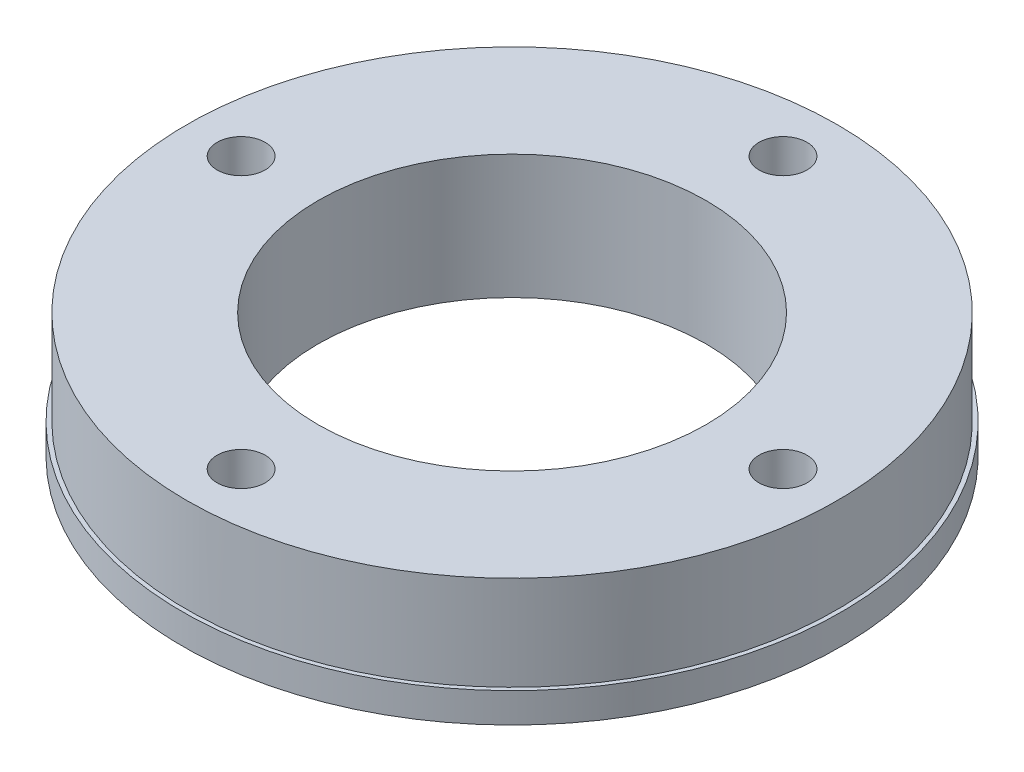
ISO-10303-21;
HEADER;
FILE_DESCRIPTION(('STEP AP214'),'2;1');
FILE_NAME('part.step','',(''),(''),'','','');
FILE_SCHEMA(('AUTOMOTIVE_DESIGN { 1 0 10303 214 1 1 1 1 }'));
ENDSEC;
DATA;
#1=APPLICATION_CONTEXT('core data for automotive mechanical design processes');
#2=APPLICATION_PROTOCOL_DEFINITION('international standard','automotive_design',2000,#1);
#3=PRODUCT_CONTEXT('',#1,'mechanical');
#4=PRODUCT('Part','Part','',(#3));
#5=PRODUCT_RELATED_PRODUCT_CATEGORY('part','',(#4));
#6=PRODUCT_DEFINITION_FORMATION('','',#4);
#7=PRODUCT_DEFINITION_CONTEXT('part definition',#1,'design');
#8=PRODUCT_DEFINITION('design','',#6,#7);
#9=PRODUCT_DEFINITION_SHAPE('','',#8);
#10=(LENGTH_UNIT() NAMED_UNIT(*) SI_UNIT(.MILLI.,.METRE.));
#11=(NAMED_UNIT(*) PLANE_ANGLE_UNIT() SI_UNIT($,.RADIAN.));
#12=(NAMED_UNIT(*) SI_UNIT($,.STERADIAN.) SOLID_ANGLE_UNIT());
#13=UNCERTAINTY_MEASURE_WITH_UNIT(LENGTH_MEASURE(1.E-05),#10,'distance_accuracy_value','');
#14=(GEOMETRIC_REPRESENTATION_CONTEXT(3) GLOBAL_UNCERTAINTY_ASSIGNED_CONTEXT((#13)) GLOBAL_UNIT_ASSIGNED_CONTEXT((#10,
#11,#12)) REPRESENTATION_CONTEXT('',''));
#15=CARTESIAN_POINT('',(0.,0.,0.));
#16=DIRECTION('',(0.,0.,1.));
#17=DIRECTION('',(1.,0.,0.));
#18=AXIS2_PLACEMENT_3D('',#15,#16,#17);
#19=CARTESIAN_POINT('',(0.,9.525,0.));
#20=DIRECTION('',(0.,1.,0.));
#21=DIRECTION('',(0.,0.,1.));
#22=AXIS2_PLACEMENT_3D('',#19,#20,#21);
#23=PLANE('',#22);
#24=CARTESIAN_POINT('',(-20.7772,9.525,0.));
#25=DIRECTION('',(0.,1.,0.));
#26=DIRECTION('',(0.,0.,-1.));
#27=AXIS2_PLACEMENT_3D('',#24,#25,#26);
#28=CIRCLE('',#27,1.8415);
#29=CARTESIAN_POINT('',(-20.7772,9.525,-1.8415));
#30=VERTEX_POINT('',#29);
#31=EDGE_CURVE('E62',#30,#30,#28,.T.);
#32=ORIENTED_EDGE('',*,*,#31,.F.);
#33=EDGE_LOOP('',(#32));
#34=FACE_BOUND('',#33,.T.);
#35=CARTESIAN_POINT('',(0.,9.525,20.7772));
#36=DIRECTION('',(0.,1.,0.));
#37=DIRECTION('',(0.,0.,-1.));
#38=AXIS2_PLACEMENT_3D('',#35,#36,#37);
#39=CIRCLE('',#38,1.8415);
#40=CARTESIAN_POINT('',(0.,9.525,18.9357));
#41=VERTEX_POINT('',#40);
#42=EDGE_CURVE('E74',#41,#41,#39,.T.);
#43=ORIENTED_EDGE('',*,*,#42,.F.);
#44=EDGE_LOOP('',(#43));
#45=FACE_BOUND('',#44,.T.);
#46=CARTESIAN_POINT('',(0.,9.525,0.));
#47=DIRECTION('',(0.,1.,0.));
#48=DIRECTION('',(0.,0.,1.));
#49=AXIS2_PLACEMENT_3D('',#46,#47,#48);
#50=CIRCLE('',#49,14.88313);
#51=CARTESIAN_POINT('',(0.,9.525,-14.88313));
#52=VERTEX_POINT('',#51);
#53=EDGE_CURVE('E40',#52,#52,#50,.T.);
#54=ORIENTED_EDGE('',*,*,#53,.F.);
#55=EDGE_LOOP('',(#54));
#56=FACE_BOUND('',#55,.T.);
#57=CARTESIAN_POINT('',(0.,9.525,-20.7772));
#58=DIRECTION('',(0.,1.,0.));
#59=DIRECTION('',(0.,0.,1.));
#60=AXIS2_PLACEMENT_3D('',#57,#58,#59);
#61=CIRCLE('',#60,1.8415);
#62=CARTESIAN_POINT('',(0.,9.525,-22.6187));
#63=VERTEX_POINT('',#62);
#64=EDGE_CURVE('E80',#63,#63,#61,.T.);
#65=ORIENTED_EDGE('',*,*,#64,.F.);
#66=EDGE_LOOP('',(#65));
#67=FACE_BOUND('',#66,.T.);
#68=CARTESIAN_POINT('',(20.7772,9.525,0.));
#69=DIRECTION('',(0.,1.,0.));
#70=DIRECTION('',(0.,0.,1.));
#71=AXIS2_PLACEMENT_3D('',#68,#69,#70);
#72=CIRCLE('',#71,1.8415);
#73=CARTESIAN_POINT('',(20.7772,9.525,-1.8415));
#74=VERTEX_POINT('',#73);
#75=EDGE_CURVE('E68',#74,#74,#72,.T.);
#76=ORIENTED_EDGE('',*,*,#75,.F.);
#77=EDGE_LOOP('',(#76));
#78=FACE_BOUND('',#77,.T.);
#79=CARTESIAN_POINT('',(0.,9.525,0.));
#80=DIRECTION('',(0.,1.,0.));
#81=DIRECTION('',(0.,0.,1.));
#82=AXIS2_PLACEMENT_3D('',#79,#80,#81);
#83=CIRCLE('',#82,24.9555);
#84=CARTESIAN_POINT('',(0.,9.525,24.9555));
#85=VERTEX_POINT('',#84);
#86=EDGE_CURVE('E36',#85,#85,#83,.T.);
#87=ORIENTED_EDGE('',*,*,#86,.T.);
#88=EDGE_LOOP('',(#87));
#89=FACE_BOUND('',#88,.T.);
#90=ADVANCED_FACE('F32',(#34,#45,#56,#67,#78,#89),#23,.T.);
#91=CARTESIAN_POINT('',(0.,9.525,0.));
#92=DIRECTION('',(0.,-1.,0.));
#93=DIRECTION('',(0.,0.,-1.));
#94=AXIS2_PLACEMENT_3D('',#91,#92,#93);
#95=CYLINDRICAL_SURFACE('',#94,25.273);
#96=CARTESIAN_POINT('',(0.,0.,0.));
#97=DIRECTION('',(0.,1.,0.));
#98=DIRECTION('',(0.,0.,1.));
#99=AXIS2_PLACEMENT_3D('',#96,#97,#98);
#100=CIRCLE('',#99,25.273);
#101=CARTESIAN_POINT('',(0.,0.,-25.273));
#102=VERTEX_POINT('',#101);
#103=EDGE_CURVE('E10',#102,#102,#100,.T.);
#104=CARTESIAN_POINT('',(0.,2.286,0.));
#105=DIRECTION('',(0.,1.,0.));
#106=DIRECTION('',(0.,0.,1.));
#107=AXIS2_PLACEMENT_3D('',#104,#105,#106);
#108=CIRCLE('',#107,25.273);
#109=CARTESIAN_POINT('',(0.,2.286,-25.273));
#110=VERTEX_POINT('',#109);
#111=EDGE_CURVE('E48',#110,#110,#108,.T.);
#112=CARTESIAN_POINT('',(0.,0.,-25.273));
#113=CARTESIAN_POINT('',(0.,0.0238125000000001,-25.273));
#114=CARTESIAN_POINT('',(0.,0.0476250000000002,-25.273));
#115=CARTESIAN_POINT('',(0.,0.0952500000000004,-25.273));
#116=CARTESIAN_POINT('',(0.,0.119062500000001,-25.273));
#117=CARTESIAN_POINT('',(0.,0.1666875,-25.273));
#118=CARTESIAN_POINT('',(0.,0.1905,-25.273));
#119=CARTESIAN_POINT('',(0.,0.238124999999999,-25.273));
#120=CARTESIAN_POINT('',(0.,0.261937499999999,-25.273));
#121=CARTESIAN_POINT('',(0.,0.3095625,-25.273));
#122=CARTESIAN_POINT('',(0.,0.333375,-25.273));
#123=CARTESIAN_POINT('',(0.,0.381,-25.273));
#124=CARTESIAN_POINT('',(0.,0.4048125,-25.273));
#125=CARTESIAN_POINT('',(0.,0.4524375,-25.273));
#126=CARTESIAN_POINT('',(0.,0.47625,-25.273));
#127=CARTESIAN_POINT('',(0.,0.523875,-25.273));
#128=CARTESIAN_POINT('',(0.,0.5476875,-25.273));
#129=CARTESIAN_POINT('',(0.,0.595312499999999,-25.273));
#130=CARTESIAN_POINT('',(0.,0.619124999999999,-25.273));
#131=CARTESIAN_POINT('',(0.,0.66675,-25.273));
#132=CARTESIAN_POINT('',(0.,0.6905625,-25.273));
#133=CARTESIAN_POINT('',(0.,0.7381875,-25.273));
#134=CARTESIAN_POINT('',(0.,0.762,-25.273));
#135=CARTESIAN_POINT('',(0.,0.809625,-25.273));
#136=CARTESIAN_POINT('',(0.,0.8334375,-25.273));
#137=CARTESIAN_POINT('',(0.,0.8810625,-25.273));
#138=CARTESIAN_POINT('',(0.,0.904875000000001,-25.273));
#139=CARTESIAN_POINT('',(0.,0.9525,-25.273));
#140=CARTESIAN_POINT('',(0.,0.9763125,-25.273));
#141=CARTESIAN_POINT('',(0.,1.0239375,-25.273));
#142=CARTESIAN_POINT('',(0.,1.04775,-25.273));
#143=CARTESIAN_POINT('',(0.,1.095375,-25.273));
#144=CARTESIAN_POINT('',(0.,1.1191875,-25.273));
#145=CARTESIAN_POINT('',(0.,1.1668125,-25.273));
#146=CARTESIAN_POINT('',(0.,1.190625,-25.273));
#147=CARTESIAN_POINT('',(0.,1.23825,-25.273));
#148=CARTESIAN_POINT('',(0.,1.2620625,-25.273));
#149=CARTESIAN_POINT('',(0.,1.3096875,-25.273));
#150=CARTESIAN_POINT('',(0.,1.3335,-25.273));
#151=CARTESIAN_POINT('',(0.,1.381125,-25.273));
#152=CARTESIAN_POINT('',(0.,1.4049375,-25.273));
#153=CARTESIAN_POINT('',(0.,1.4525625,-25.273));
#154=CARTESIAN_POINT('',(0.,1.476375,-25.273));
#155=CARTESIAN_POINT('',(0.,1.524,-25.273));
#156=CARTESIAN_POINT('',(0.,1.5478125,-25.273));
#157=CARTESIAN_POINT('',(0.,1.5954375,-25.273));
#158=CARTESIAN_POINT('',(0.,1.61925,-25.273));
#159=CARTESIAN_POINT('',(0.,1.666875,-25.273));
#160=CARTESIAN_POINT('',(0.,1.6906875,-25.273));
#161=CARTESIAN_POINT('',(0.,1.7383125,-25.273));
#162=CARTESIAN_POINT('',(0.,1.762125,-25.273));
#163=CARTESIAN_POINT('',(0.,1.80975,-25.273));
#164=CARTESIAN_POINT('',(0.,1.8335625,-25.273));
#165=CARTESIAN_POINT('',(0.,1.8811875,-25.273));
#166=CARTESIAN_POINT('',(0.,1.905,-25.273));
#167=CARTESIAN_POINT('',(0.,1.952625,-25.273));
#168=CARTESIAN_POINT('',(0.,1.9764375,-25.273));
#169=CARTESIAN_POINT('',(0.,2.0240625,-25.273));
#170=CARTESIAN_POINT('',(0.,2.047875,-25.273));
#171=CARTESIAN_POINT('',(0.,2.0955,-25.273));
#172=CARTESIAN_POINT('',(0.,2.1193125,-25.273));
#173=CARTESIAN_POINT('',(0.,2.1669375,-25.273));
#174=CARTESIAN_POINT('',(0.,2.19075,-25.273));
#175=CARTESIAN_POINT('',(0.,2.238375,-25.273));
#176=CARTESIAN_POINT('',(0.,2.2621875,-25.273));
#177=CARTESIAN_POINT('',(0.,2.286,-25.273));
#178=B_SPLINE_CURVE_WITH_KNOTS('',3,(#112,#113,#114,#115,#116,#117,#118,#119,#120,#121,#122,
#123,#124,#125,#126,#127,#128,#129,#130,#131,#132,#133,#134,#135,#136,#137,#138,#139,#140,#141,
#142,#143,#144,#145,#146,#147,#148,#149,#150,#151,#152,#153,#154,#155,#156,#157,#158,#159,#160,
#161,#162,#163,#164,#165,#166,#167,#168,#169,#170,#171,#172,#173,#174,#175,#176,#177),
.UNSPECIFIED.,.F.,.F.,(4,2,2,2,2,2,2,2,2,2,2,2,2,2,2,2,2,2,2,2,2,2,2,2,2,2,2,2,2,2,2,2,4),(0.,
0.0714375000000003,0.142875000000001,0.214312499999999,0.28575,0.3571875,0.428625,
0.500062500000001,0.571499999999999,0.642937499999999,0.714375,0.7858125,0.85725,
0.928687500000001,1.000125,1.0715625,1.143,1.2144375,1.285875,1.3573125,1.42875,1.5001875,
1.571625,1.6430625,1.7145,1.7859375,1.857375,1.9288125,2.00025,2.0716875,2.143125,2.2145625,
2.286),.UNSPECIFIED.);
#179=EDGE_CURVE('BSEAM34',#102,#110,#178,.T.);
#180=ORIENTED_EDGE('',*,*,#103,.T.);
#181=ORIENTED_EDGE('',*,*,#111,.F.);
#182=ORIENTED_EDGE('',*,*,#179,.T.);
#183=ORIENTED_EDGE('',*,*,#179,.F.);
#184=EDGE_LOOP('',(#180,#182,#181,#183));
#185=FACE_BOUND('',#184,.T.);
#186=ADVANCED_FACE('F34',(#185),#95,.T.);
#187=CARTESIAN_POINT('',(0.,0.,0.));
#188=DIRECTION('',(0.,1.,0.));
#189=DIRECTION('',(0.,0.,1.));
#190=AXIS2_PLACEMENT_3D('',#187,#188,#189);
#191=PLANE('',#190);
#192=CARTESIAN_POINT('',(20.7772,0.,0.));
#193=DIRECTION('',(0.,1.,0.));
#194=DIRECTION('',(0.,0.,1.));
#195=AXIS2_PLACEMENT_3D('',#192,#193,#194);
#196=CIRCLE('',#195,1.8415);
#197=CARTESIAN_POINT('',(20.7772,0.,-1.8415));
#198=VERTEX_POINT('',#197);
#199=EDGE_CURVE('E65',#198,#198,#196,.T.);
#200=ORIENTED_EDGE('',*,*,#199,.T.);
#201=EDGE_LOOP('',(#200));
#202=FACE_BOUND('',#201,.T.);
#203=CARTESIAN_POINT('',(0.,0.,-20.7772));
#204=DIRECTION('',(0.,1.,0.));
#205=DIRECTION('',(0.,0.,1.));
#206=AXIS2_PLACEMENT_3D('',#203,#204,#205);
#207=CIRCLE('',#206,1.8415);
#208=CARTESIAN_POINT('',(0.,0.,-22.6187));
#209=VERTEX_POINT('',#208);
#210=EDGE_CURVE('E77',#209,#209,#207,.T.);
#211=ORIENTED_EDGE('',*,*,#210,.T.);
#212=EDGE_LOOP('',(#211));
#213=FACE_BOUND('',#212,.T.);
#214=ORIENTED_EDGE('',*,*,#103,.F.);
#215=EDGE_LOOP('',(#214));
#216=FACE_BOUND('',#215,.T.);
#217=CARTESIAN_POINT('',(0.,0.,0.));
#218=DIRECTION('',(0.,1.,0.));
#219=DIRECTION('',(0.,0.,1.));
#220=AXIS2_PLACEMENT_3D('',#217,#218,#219);
#221=CIRCLE('',#220,14.88313);
#222=CARTESIAN_POINT('',(0.,0.,-14.88313));
#223=VERTEX_POINT('',#222);
#224=EDGE_CURVE('E45',#223,#223,#221,.T.);
#225=ORIENTED_EDGE('',*,*,#224,.T.);
#226=EDGE_LOOP('',(#225));
#227=FACE_BOUND('',#226,.T.);
#228=CARTESIAN_POINT('',(0.,0.,20.7772));
#229=DIRECTION('',(0.,1.,0.));
#230=DIRECTION('',(0.,0.,-1.));
#231=AXIS2_PLACEMENT_3D('',#228,#229,#230);
#232=CIRCLE('',#231,1.8415);
#233=CARTESIAN_POINT('',(0.,0.,18.9357));
#234=VERTEX_POINT('',#233);
#235=EDGE_CURVE('E71',#234,#234,#232,.T.);
#236=ORIENTED_EDGE('',*,*,#235,.T.);
#237=EDGE_LOOP('',(#236));
#238=FACE_BOUND('',#237,.T.);
#239=CARTESIAN_POINT('',(-20.7772,0.,0.));
#240=DIRECTION('',(0.,1.,0.));
#241=DIRECTION('',(0.,0.,-1.));
#242=AXIS2_PLACEMENT_3D('',#239,#240,#241);
#243=CIRCLE('',#242,1.8415);
#244=CARTESIAN_POINT('',(-20.7772,0.,-1.8415));
#245=VERTEX_POINT('',#244);
#246=EDGE_CURVE('E54',#245,#245,#243,.T.);
#247=ORIENTED_EDGE('',*,*,#246,.T.);
#248=EDGE_LOOP('',(#247));
#249=FACE_BOUND('',#248,.T.);
#250=ADVANCED_FACE('F85',(#202,#213,#216,#227,#238,#249),#191,.F.);
#251=CARTESIAN_POINT('',(0.,9.525,0.));
#252=DIRECTION('',(0.,-1.,0.));
#253=DIRECTION('',(0.,0.,-1.));
#254=AXIS2_PLACEMENT_3D('',#251,#252,#253);
#255=CYLINDRICAL_SURFACE('',#254,14.88313);
#256=CARTESIAN_POINT('',(0.,9.525,-14.88313));
#257=CARTESIAN_POINT('',(0.,9.42578125,-14.88313));
#258=CARTESIAN_POINT('',(0.,9.3265625,-14.88313));
#259=CARTESIAN_POINT('',(0.,9.128125,-14.88313));
#260=CARTESIAN_POINT('',(0.,9.02890625,-14.88313));
#261=CARTESIAN_POINT('',(0.,8.83046875,-14.88313));
#262=CARTESIAN_POINT('',(0.,8.73125,-14.88313));
#263=CARTESIAN_POINT('',(0.,8.5328125,-14.88313));
#264=CARTESIAN_POINT('',(0.,8.43359375,-14.88313));
#265=CARTESIAN_POINT('',(0.,8.23515625,-14.88313));
#266=CARTESIAN_POINT('',(0.,8.1359375,-14.88313));
#267=CARTESIAN_POINT('',(0.,7.9375,-14.88313));
#268=CARTESIAN_POINT('',(0.,7.83828125,-14.88313));
#269=CARTESIAN_POINT('',(0.,7.63984375,-14.88313));
#270=CARTESIAN_POINT('',(0.,7.540625,-14.88313));
#271=CARTESIAN_POINT('',(0.,7.3421875,-14.88313));
#272=CARTESIAN_POINT('',(0.,7.24296875,-14.88313));
#273=CARTESIAN_POINT('',(0.,7.04453125,-14.88313));
#274=CARTESIAN_POINT('',(0.,6.9453125,-14.88313));
#275=CARTESIAN_POINT('',(0.,6.746875,-14.88313));
#276=CARTESIAN_POINT('',(0.,6.64765625,-14.88313));
#277=CARTESIAN_POINT('',(0.,6.44921875,-14.88313));
#278=CARTESIAN_POINT('',(0.,6.35,-14.88313));
#279=CARTESIAN_POINT('',(0.,6.1515625,-14.88313));
#280=CARTESIAN_POINT('',(0.,6.05234375,-14.88313));
#281=CARTESIAN_POINT('',(0.,5.85390625,-14.88313));
#282=CARTESIAN_POINT('',(0.,5.7546875,-14.88313));
#283=CARTESIAN_POINT('',(0.,5.55625,-14.88313));
#284=CARTESIAN_POINT('',(0.,5.45703125,-14.88313));
#285=CARTESIAN_POINT('',(0.,5.25859375,-14.88313));
#286=CARTESIAN_POINT('',(0.,5.159375,-14.88313));
#287=CARTESIAN_POINT('',(0.,4.9609375,-14.88313));
#288=CARTESIAN_POINT('',(0.,4.86171875,-14.88313));
#289=CARTESIAN_POINT('',(0.,4.66328125,-14.88313));
#290=CARTESIAN_POINT('',(0.,4.5640625,-14.88313));
#291=CARTESIAN_POINT('',(0.,4.365625,-14.88313));
#292=CARTESIAN_POINT('',(0.,4.26640625,-14.88313));
#293=CARTESIAN_POINT('',(0.,4.06796875,-14.88313));
#294=CARTESIAN_POINT('',(0.,3.96875,-14.88313));
#295=CARTESIAN_POINT('',(0.,3.7703125,-14.88313));
#296=CARTESIAN_POINT('',(0.,3.67109375,-14.88313));
#297=CARTESIAN_POINT('',(0.,3.47265625,-14.88313));
#298=CARTESIAN_POINT('',(0.,3.3734375,-14.88313));
#299=CARTESIAN_POINT('',(0.,3.175,-14.88313));
#300=CARTESIAN_POINT('',(0.,3.07578125,-14.88313));
#301=CARTESIAN_POINT('',(0.,2.87734375,-14.88313));
#302=CARTESIAN_POINT('',(0.,2.778125,-14.88313));
#303=CARTESIAN_POINT('',(0.,2.5796875,-14.88313));
#304=CARTESIAN_POINT('',(0.,2.48046875,-14.88313));
#305=CARTESIAN_POINT('',(0.,2.28203125,-14.88313));
#306=CARTESIAN_POINT('',(0.,2.1828125,-14.88313));
#307=CARTESIAN_POINT('',(0.,1.984375,-14.88313));
#308=CARTESIAN_POINT('',(0.,1.88515625,-14.88313));
#309=CARTESIAN_POINT('',(0.,1.68671875,-14.88313));
#310=CARTESIAN_POINT('',(0.,1.5875,-14.88313));
#311=CARTESIAN_POINT('',(0.,1.3890625,-14.88313));
#312=CARTESIAN_POINT('',(0.,1.28984375,-14.88313));
#313=CARTESIAN_POINT('',(0.,1.09140625,-14.88313));
#314=CARTESIAN_POINT('',(0.,0.992187500000001,-14.88313));
#315=CARTESIAN_POINT('',(0.,0.793750000000001,-14.88313));
#316=CARTESIAN_POINT('',(0.,0.69453125,-14.88313));
#317=CARTESIAN_POINT('',(0.,0.49609375,-14.88313));
#318=CARTESIAN_POINT('',(0.,0.396875,-14.88313));
#319=CARTESIAN_POINT('',(0.,0.1984375,-14.88313));
#320=CARTESIAN_POINT('',(0.,0.0992187500000001,-14.88313));
#321=CARTESIAN_POINT('',(0.,0.,-14.88313));
#322=B_SPLINE_CURVE_WITH_KNOTS('',3,(#256,#257,#258,#259,#260,#261,#262,#263,#264,#265,#266,
#267,#268,#269,#270,#271,#272,#273,#274,#275,#276,#277,#278,#279,#280,#281,#282,#283,#284,#285,
#286,#287,#288,#289,#290,#291,#292,#293,#294,#295,#296,#297,#298,#299,#300,#301,#302,#303,#304,
#305,#306,#307,#308,#309,#310,#311,#312,#313,#314,#315,#316,#317,#318,#319,#320,#321),
.UNSPECIFIED.,.F.,.F.,(4,2,2,2,2,2,2,2,2,2,2,2,2,2,2,2,2,2,2,2,2,2,2,2,2,2,2,2,2,2,2,2,4),(0.,
0.29765625,0.5953125,0.892968750000001,1.190625,1.48828125,1.7859375,2.08359375,2.38125,
2.67890625,2.9765625,3.27421875,3.571875,3.86953125,4.1671875,4.46484375,4.7625,5.06015625,
5.3578125,5.65546875,5.953125,6.25078125,6.5484375,6.84609375,7.14375,7.44140625,7.7390625,
8.03671875,8.334375,8.63203125,8.9296875,9.22734375,9.525),.UNSPECIFIED.);
#323=EDGE_CURVE('BSEAM88',#52,#223,#322,.T.);
#324=ORIENTED_EDGE('',*,*,#53,.T.);
#325=ORIENTED_EDGE('',*,*,#224,.F.);
#326=ORIENTED_EDGE('',*,*,#323,.T.);
#327=ORIENTED_EDGE('',*,*,#323,.F.);
#328=EDGE_LOOP('',(#324,#326,#325,#327));
#329=FACE_BOUND('',#328,.T.);
#330=ADVANCED_FACE('F88',(#329),#255,.F.);
#331=CARTESIAN_POINT('',(0.,9.525,-20.7772));
#332=DIRECTION('',(0.,-1.,0.));
#333=DIRECTION('',(0.,0.,-1.));
#334=AXIS2_PLACEMENT_3D('',#331,#332,#333);
#335=CYLINDRICAL_SURFACE('',#334,1.8415);
#336=CARTESIAN_POINT('',(0.,9.525,-22.6187));
#337=CARTESIAN_POINT('',(0.,9.42578125,-22.6187));
#338=CARTESIAN_POINT('',(0.,9.3265625,-22.6187));
#339=CARTESIAN_POINT('',(0.,9.128125,-22.6187));
#340=CARTESIAN_POINT('',(0.,9.02890625,-22.6187));
#341=CARTESIAN_POINT('',(0.,8.83046875,-22.6187));
#342=CARTESIAN_POINT('',(0.,8.73125,-22.6187));
#343=CARTESIAN_POINT('',(0.,8.5328125,-22.6187));
#344=CARTESIAN_POINT('',(0.,8.43359375,-22.6187));
#345=CARTESIAN_POINT('',(0.,8.23515625,-22.6187));
#346=CARTESIAN_POINT('',(0.,8.1359375,-22.6187));
#347=CARTESIAN_POINT('',(0.,7.9375,-22.6187));
#348=CARTESIAN_POINT('',(0.,7.83828125,-22.6187));
#349=CARTESIAN_POINT('',(0.,7.63984375,-22.6187));
#350=CARTESIAN_POINT('',(0.,7.540625,-22.6187));
#351=CARTESIAN_POINT('',(0.,7.3421875,-22.6187));
#352=CARTESIAN_POINT('',(0.,7.24296875,-22.6187));
#353=CARTESIAN_POINT('',(0.,7.04453125,-22.6187));
#354=CARTESIAN_POINT('',(0.,6.9453125,-22.6187));
#355=CARTESIAN_POINT('',(0.,6.746875,-22.6187));
#356=CARTESIAN_POINT('',(0.,6.64765625,-22.6187));
#357=CARTESIAN_POINT('',(0.,6.44921875,-22.6187));
#358=CARTESIAN_POINT('',(0.,6.35,-22.6187));
#359=CARTESIAN_POINT('',(0.,6.1515625,-22.6187));
#360=CARTESIAN_POINT('',(0.,6.05234375,-22.6187));
#361=CARTESIAN_POINT('',(0.,5.85390625,-22.6187));
#362=CARTESIAN_POINT('',(0.,5.7546875,-22.6187));
#363=CARTESIAN_POINT('',(0.,5.55625,-22.6187));
#364=CARTESIAN_POINT('',(0.,5.45703125,-22.6187));
#365=CARTESIAN_POINT('',(0.,5.25859375,-22.6187));
#366=CARTESIAN_POINT('',(0.,5.159375,-22.6187));
#367=CARTESIAN_POINT('',(0.,4.9609375,-22.6187));
#368=CARTESIAN_POINT('',(0.,4.86171875,-22.6187));
#369=CARTESIAN_POINT('',(0.,4.66328125,-22.6187));
#370=CARTESIAN_POINT('',(0.,4.5640625,-22.6187));
#371=CARTESIAN_POINT('',(0.,4.365625,-22.6187));
#372=CARTESIAN_POINT('',(0.,4.26640625,-22.6187));
#373=CARTESIAN_POINT('',(0.,4.06796875,-22.6187));
#374=CARTESIAN_POINT('',(0.,3.96875,-22.6187));
#375=CARTESIAN_POINT('',(0.,3.7703125,-22.6187));
#376=CARTESIAN_POINT('',(0.,3.67109375,-22.6187));
#377=CARTESIAN_POINT('',(0.,3.47265625,-22.6187));
#378=CARTESIAN_POINT('',(0.,3.3734375,-22.6187));
#379=CARTESIAN_POINT('',(0.,3.175,-22.6187));
#380=CARTESIAN_POINT('',(0.,3.07578125,-22.6187));
#381=CARTESIAN_POINT('',(0.,2.87734375,-22.6187));
#382=CARTESIAN_POINT('',(0.,2.778125,-22.6187));
#383=CARTESIAN_POINT('',(0.,2.5796875,-22.6187));
#384=CARTESIAN_POINT('',(0.,2.48046875,-22.6187));
#385=CARTESIAN_POINT('',(0.,2.28203125,-22.6187));
#386=CARTESIAN_POINT('',(0.,2.1828125,-22.6187));
#387=CARTESIAN_POINT('',(0.,1.984375,-22.6187));
#388=CARTESIAN_POINT('',(0.,1.88515625,-22.6187));
#389=CARTESIAN_POINT('',(0.,1.68671875,-22.6187));
#390=CARTESIAN_POINT('',(0.,1.5875,-22.6187));
#391=CARTESIAN_POINT('',(0.,1.3890625,-22.6187));
#392=CARTESIAN_POINT('',(0.,1.28984375,-22.6187));
#393=CARTESIAN_POINT('',(0.,1.09140625,-22.6187));
#394=CARTESIAN_POINT('',(0.,0.992187500000001,-22.6187));
#395=CARTESIAN_POINT('',(0.,0.793750000000001,-22.6187));
#396=CARTESIAN_POINT('',(0.,0.69453125,-22.6187));
#397=CARTESIAN_POINT('',(0.,0.49609375,-22.6187));
#398=CARTESIAN_POINT('',(0.,0.396875,-22.6187));
#399=CARTESIAN_POINT('',(0.,0.1984375,-22.6187));
#400=CARTESIAN_POINT('',(0.,0.0992187500000001,-22.6187));
#401=CARTESIAN_POINT('',(0.,0.,-22.6187));
#402=B_SPLINE_CURVE_WITH_KNOTS('',3,(#336,#337,#338,#339,#340,#341,#342,#343,#344,#345,#346,
#347,#348,#349,#350,#351,#352,#353,#354,#355,#356,#357,#358,#359,#360,#361,#362,#363,#364,#365,
#366,#367,#368,#369,#370,#371,#372,#373,#374,#375,#376,#377,#378,#379,#380,#381,#382,#383,#384,
#385,#386,#387,#388,#389,#390,#391,#392,#393,#394,#395,#396,#397,#398,#399,#400,#401),
.UNSPECIFIED.,.F.,.F.,(4,2,2,2,2,2,2,2,2,2,2,2,2,2,2,2,2,2,2,2,2,2,2,2,2,2,2,2,2,2,2,2,4),(0.,
0.297656249999998,0.595312499999999,0.892968749999999,1.190625,1.48828125,1.7859375,2.08359375,
2.38125,2.67890625,2.9765625,3.27421875,3.571875,3.86953125,4.1671875,4.46484375,4.7625,
5.06015625,5.3578125,5.65546875,5.953125,6.25078125,6.5484375,6.84609375,7.14375,7.44140625,
7.7390625,8.03671875,8.334375,8.63203125,8.9296875,9.22734375,9.525),.UNSPECIFIED.);
#403=EDGE_CURVE('BSEAM90',#63,#209,#402,.T.);
#404=ORIENTED_EDGE('',*,*,#64,.T.);
#405=ORIENTED_EDGE('',*,*,#210,.F.);
#406=ORIENTED_EDGE('',*,*,#403,.T.);
#407=ORIENTED_EDGE('',*,*,#403,.F.);
#408=EDGE_LOOP('',(#404,#406,#405,#407));
#409=FACE_BOUND('',#408,.T.);
#410=ADVANCED_FACE('F90',(#409),#335,.F.);
#411=CARTESIAN_POINT('',(0.,9.525,20.7772));
#412=DIRECTION('',(0.,-1.,0.));
#413=DIRECTION('',(0.,0.,-1.));
#414=AXIS2_PLACEMENT_3D('',#411,#412,#413);
#415=CYLINDRICAL_SURFACE('',#414,1.8415);
#416=CARTESIAN_POINT('',(0.,9.525,18.9357));
#417=CARTESIAN_POINT('',(0.,9.42578125,18.9357));
#418=CARTESIAN_POINT('',(0.,9.3265625,18.9357));
#419=CARTESIAN_POINT('',(0.,9.128125,18.9357));
#420=CARTESIAN_POINT('',(0.,9.02890625,18.9357));
#421=CARTESIAN_POINT('',(0.,8.83046875,18.9357));
#422=CARTESIAN_POINT('',(0.,8.73125,18.9357));
#423=CARTESIAN_POINT('',(0.,8.5328125,18.9357));
#424=CARTESIAN_POINT('',(0.,8.43359375,18.9357));
#425=CARTESIAN_POINT('',(0.,8.23515625,18.9357));
#426=CARTESIAN_POINT('',(0.,8.1359375,18.9357));
#427=CARTESIAN_POINT('',(0.,7.9375,18.9357));
#428=CARTESIAN_POINT('',(0.,7.83828125,18.9357));
#429=CARTESIAN_POINT('',(0.,7.63984375,18.9357));
#430=CARTESIAN_POINT('',(0.,7.540625,18.9357));
#431=CARTESIAN_POINT('',(0.,7.3421875,18.9357));
#432=CARTESIAN_POINT('',(0.,7.24296875,18.9357));
#433=CARTESIAN_POINT('',(0.,7.04453125,18.9357));
#434=CARTESIAN_POINT('',(0.,6.9453125,18.9357));
#435=CARTESIAN_POINT('',(0.,6.746875,18.9357));
#436=CARTESIAN_POINT('',(0.,6.64765625,18.9357));
#437=CARTESIAN_POINT('',(0.,6.44921875,18.9357));
#438=CARTESIAN_POINT('',(0.,6.35,18.9357));
#439=CARTESIAN_POINT('',(0.,6.1515625,18.9357));
#440=CARTESIAN_POINT('',(0.,6.05234375,18.9357));
#441=CARTESIAN_POINT('',(0.,5.85390625,18.9357));
#442=CARTESIAN_POINT('',(0.,5.7546875,18.9357));
#443=CARTESIAN_POINT('',(0.,5.55625,18.9357));
#444=CARTESIAN_POINT('',(0.,5.45703125,18.9357));
#445=CARTESIAN_POINT('',(0.,5.25859375,18.9357));
#446=CARTESIAN_POINT('',(0.,5.159375,18.9357));
#447=CARTESIAN_POINT('',(0.,4.9609375,18.9357));
#448=CARTESIAN_POINT('',(0.,4.86171875,18.9357));
#449=CARTESIAN_POINT('',(0.,4.66328125,18.9357));
#450=CARTESIAN_POINT('',(0.,4.5640625,18.9357));
#451=CARTESIAN_POINT('',(0.,4.365625,18.9357));
#452=CARTESIAN_POINT('',(0.,4.26640625,18.9357));
#453=CARTESIAN_POINT('',(0.,4.06796875,18.9357));
#454=CARTESIAN_POINT('',(0.,3.96875,18.9357));
#455=CARTESIAN_POINT('',(0.,3.7703125,18.9357));
#456=CARTESIAN_POINT('',(0.,3.67109375,18.9357));
#457=CARTESIAN_POINT('',(0.,3.47265625,18.9357));
#458=CARTESIAN_POINT('',(0.,3.3734375,18.9357));
#459=CARTESIAN_POINT('',(0.,3.175,18.9357));
#460=CARTESIAN_POINT('',(0.,3.07578125,18.9357));
#461=CARTESIAN_POINT('',(0.,2.87734375,18.9357));
#462=CARTESIAN_POINT('',(0.,2.778125,18.9357));
#463=CARTESIAN_POINT('',(0.,2.5796875,18.9357));
#464=CARTESIAN_POINT('',(0.,2.48046875,18.9357));
#465=CARTESIAN_POINT('',(0.,2.28203125,18.9357));
#466=CARTESIAN_POINT('',(0.,2.1828125,18.9357));
#467=CARTESIAN_POINT('',(0.,1.984375,18.9357));
#468=CARTESIAN_POINT('',(0.,1.88515625,18.9357));
#469=CARTESIAN_POINT('',(0.,1.68671875,18.9357));
#470=CARTESIAN_POINT('',(0.,1.5875,18.9357));
#471=CARTESIAN_POINT('',(0.,1.3890625,18.9357));
#472=CARTESIAN_POINT('',(0.,1.28984375,18.9357));
#473=CARTESIAN_POINT('',(0.,1.09140625,18.9357));
#474=CARTESIAN_POINT('',(0.,0.992187500000001,18.9357));
#475=CARTESIAN_POINT('',(0.,0.793750000000001,18.9357));
#476=CARTESIAN_POINT('',(0.,0.69453125,18.9357));
#477=CARTESIAN_POINT('',(0.,0.49609375,18.9357));
#478=CARTESIAN_POINT('',(0.,0.396875,18.9357));
#479=CARTESIAN_POINT('',(0.,0.1984375,18.9357));
#480=CARTESIAN_POINT('',(0.,0.0992187500000001,18.9357));
#481=CARTESIAN_POINT('',(0.,0.,18.9357));
#482=B_SPLINE_CURVE_WITH_KNOTS('',3,(#416,#417,#418,#419,#420,#421,#422,#423,#424,#425,#426,
#427,#428,#429,#430,#431,#432,#433,#434,#435,#436,#437,#438,#439,#440,#441,#442,#443,#444,#445,
#446,#447,#448,#449,#450,#451,#452,#453,#454,#455,#456,#457,#458,#459,#460,#461,#462,#463,#464,
#465,#466,#467,#468,#469,#470,#471,#472,#473,#474,#475,#476,#477,#478,#479,#480,#481),
.UNSPECIFIED.,.F.,.F.,(4,2,2,2,2,2,2,2,2,2,2,2,2,2,2,2,2,2,2,2,2,2,2,2,2,2,2,2,2,2,2,2,4),(0.,
0.297656249999998,0.595312499999999,0.892968749999999,1.190625,1.48828125,1.7859375,2.08359375,
2.38125,2.67890625,2.9765625,3.27421875,3.571875,3.86953125,4.1671875,4.46484375,4.7625,
5.06015625,5.3578125,5.65546875,5.953125,6.25078125,6.5484375,6.84609375,7.14375,7.44140625,
7.7390625,8.03671875,8.334375,8.63203125,8.9296875,9.22734375,9.525),.UNSPECIFIED.);
#483=EDGE_CURVE('BSEAM97',#41,#234,#482,.T.);
#484=ORIENTED_EDGE('',*,*,#42,.T.);
#485=ORIENTED_EDGE('',*,*,#235,.F.);
#486=ORIENTED_EDGE('',*,*,#483,.T.);
#487=ORIENTED_EDGE('',*,*,#483,.F.);
#488=EDGE_LOOP('',(#484,#486,#485,#487));
#489=FACE_BOUND('',#488,.T.);
#490=ADVANCED_FACE('F97',(#489),#415,.F.);
#491=CARTESIAN_POINT('',(20.7772,9.525,0.));
#492=DIRECTION('',(0.,-1.,0.));
#493=DIRECTION('',(0.,0.,-1.));
#494=AXIS2_PLACEMENT_3D('',#491,#492,#493);
#495=CYLINDRICAL_SURFACE('',#494,1.8415);
#496=CARTESIAN_POINT('',(20.7772,9.525,-1.8415));
#497=CARTESIAN_POINT('',(20.7772,9.42578125,-1.8415));
#498=CARTESIAN_POINT('',(20.7772,9.3265625,-1.8415));
#499=CARTESIAN_POINT('',(20.7772,9.128125,-1.8415));
#500=CARTESIAN_POINT('',(20.7772,9.02890625,-1.8415));
#501=CARTESIAN_POINT('',(20.7772,8.83046875,-1.8415));
#502=CARTESIAN_POINT('',(20.7772,8.73125,-1.8415));
#503=CARTESIAN_POINT('',(20.7772,8.5328125,-1.8415));
#504=CARTESIAN_POINT('',(20.7772,8.43359375,-1.8415));
#505=CARTESIAN_POINT('',(20.7772,8.23515625,-1.8415));
#506=CARTESIAN_POINT('',(20.7772,8.1359375,-1.8415));
#507=CARTESIAN_POINT('',(20.7772,7.9375,-1.8415));
#508=CARTESIAN_POINT('',(20.7772,7.83828125,-1.8415));
#509=CARTESIAN_POINT('',(20.7772,7.63984375,-1.8415));
#510=CARTESIAN_POINT('',(20.7772,7.540625,-1.8415));
#511=CARTESIAN_POINT('',(20.7772,7.3421875,-1.8415));
#512=CARTESIAN_POINT('',(20.7772,7.24296875,-1.8415));
#513=CARTESIAN_POINT('',(20.7772,7.04453125,-1.8415));
#514=CARTESIAN_POINT('',(20.7772,6.9453125,-1.8415));
#515=CARTESIAN_POINT('',(20.7772,6.746875,-1.8415));
#516=CARTESIAN_POINT('',(20.7772,6.64765625,-1.8415));
#517=CARTESIAN_POINT('',(20.7772,6.44921875,-1.8415));
#518=CARTESIAN_POINT('',(20.7772,6.35,-1.8415));
#519=CARTESIAN_POINT('',(20.7772,6.1515625,-1.8415));
#520=CARTESIAN_POINT('',(20.7772,6.05234375,-1.8415));
#521=CARTESIAN_POINT('',(20.7772,5.85390625,-1.8415));
#522=CARTESIAN_POINT('',(20.7772,5.7546875,-1.8415));
#523=CARTESIAN_POINT('',(20.7772,5.55625,-1.8415));
#524=CARTESIAN_POINT('',(20.7772,5.45703125,-1.8415));
#525=CARTESIAN_POINT('',(20.7772,5.25859375,-1.8415));
#526=CARTESIAN_POINT('',(20.7772,5.159375,-1.8415));
#527=CARTESIAN_POINT('',(20.7772,4.9609375,-1.8415));
#528=CARTESIAN_POINT('',(20.7772,4.86171875,-1.8415));
#529=CARTESIAN_POINT('',(20.7772,4.66328125,-1.8415));
#530=CARTESIAN_POINT('',(20.7772,4.5640625,-1.8415));
#531=CARTESIAN_POINT('',(20.7772,4.365625,-1.8415));
#532=CARTESIAN_POINT('',(20.7772,4.26640625,-1.8415));
#533=CARTESIAN_POINT('',(20.7772,4.06796875,-1.8415));
#534=CARTESIAN_POINT('',(20.7772,3.96875,-1.8415));
#535=CARTESIAN_POINT('',(20.7772,3.7703125,-1.8415));
#536=CARTESIAN_POINT('',(20.7772,3.67109375,-1.8415));
#537=CARTESIAN_POINT('',(20.7772,3.47265625,-1.8415));
#538=CARTESIAN_POINT('',(20.7772,3.3734375,-1.8415));
#539=CARTESIAN_POINT('',(20.7772,3.175,-1.8415));
#540=CARTESIAN_POINT('',(20.7772,3.07578125,-1.8415));
#541=CARTESIAN_POINT('',(20.7772,2.87734375,-1.8415));
#542=CARTESIAN_POINT('',(20.7772,2.778125,-1.8415));
#543=CARTESIAN_POINT('',(20.7772,2.5796875,-1.8415));
#544=CARTESIAN_POINT('',(20.7772,2.48046875,-1.8415));
#545=CARTESIAN_POINT('',(20.7772,2.28203125,-1.8415));
#546=CARTESIAN_POINT('',(20.7772,2.1828125,-1.8415));
#547=CARTESIAN_POINT('',(20.7772,1.984375,-1.8415));
#548=CARTESIAN_POINT('',(20.7772,1.88515625,-1.8415));
#549=CARTESIAN_POINT('',(20.7772,1.68671875,-1.8415));
#550=CARTESIAN_POINT('',(20.7772,1.5875,-1.8415));
#551=CARTESIAN_POINT('',(20.7772,1.3890625,-1.8415));
#552=CARTESIAN_POINT('',(20.7772,1.28984375,-1.8415));
#553=CARTESIAN_POINT('',(20.7772,1.09140625,-1.8415));
#554=CARTESIAN_POINT('',(20.7772,0.992187500000001,-1.8415));
#555=CARTESIAN_POINT('',(20.7772,0.793750000000001,-1.8415));
#556=CARTESIAN_POINT('',(20.7772,0.69453125,-1.8415));
#557=CARTESIAN_POINT('',(20.7772,0.49609375,-1.8415));
#558=CARTESIAN_POINT('',(20.7772,0.396875,-1.8415));
#559=CARTESIAN_POINT('',(20.7772,0.1984375,-1.8415));
#560=CARTESIAN_POINT('',(20.7772,0.0992187500000001,-1.8415));
#561=CARTESIAN_POINT('',(20.7772,0.,-1.8415));
#562=B_SPLINE_CURVE_WITH_KNOTS('',3,(#496,#497,#498,#499,#500,#501,#502,#503,#504,#505,#506,
#507,#508,#509,#510,#511,#512,#513,#514,#515,#516,#517,#518,#519,#520,#521,#522,#523,#524,#525,
#526,#527,#528,#529,#530,#531,#532,#533,#534,#535,#536,#537,#538,#539,#540,#541,#542,#543,#544,
#545,#546,#547,#548,#549,#550,#551,#552,#553,#554,#555,#556,#557,#558,#559,#560,#561),
.UNSPECIFIED.,.F.,.F.,(4,2,2,2,2,2,2,2,2,2,2,2,2,2,2,2,2,2,2,2,2,2,2,2,2,2,2,2,2,2,2,2,4),(0.,
0.297656249999998,0.595312499999999,0.892968749999999,1.190625,1.48828125,1.7859375,2.08359375,
2.38125,2.67890625,2.9765625,3.27421875,3.571875,3.86953125,4.1671875,4.46484375,4.7625,
5.06015625,5.3578125,5.65546875,5.953125,6.25078125,6.5484375,6.84609375,7.14375,7.44140625,
7.7390625,8.03671875,8.334375,8.63203125,8.9296875,9.22734375,9.525),.UNSPECIFIED.);
#563=EDGE_CURVE('BSEAM132',#74,#198,#562,.T.);
#564=ORIENTED_EDGE('',*,*,#75,.T.);
#565=ORIENTED_EDGE('',*,*,#199,.F.);
#566=ORIENTED_EDGE('',*,*,#563,.T.);
#567=ORIENTED_EDGE('',*,*,#563,.F.);
#568=EDGE_LOOP('',(#564,#566,#565,#567));
#569=FACE_BOUND('',#568,.T.);
#570=ADVANCED_FACE('F132',(#569),#495,.F.);
#571=CARTESIAN_POINT('',(-20.7772,9.525,0.));
#572=DIRECTION('',(0.,-1.,0.));
#573=DIRECTION('',(0.,0.,-1.));
#574=AXIS2_PLACEMENT_3D('',#571,#572,#573);
#575=CYLINDRICAL_SURFACE('',#574,1.8415);
#576=CARTESIAN_POINT('',(-20.7772,9.525,-1.8415));
#577=CARTESIAN_POINT('',(-20.7772,9.42578125,-1.8415));
#578=CARTESIAN_POINT('',(-20.7772,9.3265625,-1.8415));
#579=CARTESIAN_POINT('',(-20.7772,9.128125,-1.8415));
#580=CARTESIAN_POINT('',(-20.7772,9.02890625,-1.8415));
#581=CARTESIAN_POINT('',(-20.7772,8.83046875,-1.8415));
#582=CARTESIAN_POINT('',(-20.7772,8.73125,-1.8415));
#583=CARTESIAN_POINT('',(-20.7772,8.5328125,-1.8415));
#584=CARTESIAN_POINT('',(-20.7772,8.43359375,-1.8415));
#585=CARTESIAN_POINT('',(-20.7772,8.23515625,-1.8415));
#586=CARTESIAN_POINT('',(-20.7772,8.1359375,-1.8415));
#587=CARTESIAN_POINT('',(-20.7772,7.9375,-1.8415));
#588=CARTESIAN_POINT('',(-20.7772,7.83828125,-1.8415));
#589=CARTESIAN_POINT('',(-20.7772,7.63984375,-1.8415));
#590=CARTESIAN_POINT('',(-20.7772,7.540625,-1.8415));
#591=CARTESIAN_POINT('',(-20.7772,7.3421875,-1.8415));
#592=CARTESIAN_POINT('',(-20.7772,7.24296875,-1.8415));
#593=CARTESIAN_POINT('',(-20.7772,7.04453125,-1.8415));
#594=CARTESIAN_POINT('',(-20.7772,6.9453125,-1.8415));
#595=CARTESIAN_POINT('',(-20.7772,6.746875,-1.8415));
#596=CARTESIAN_POINT('',(-20.7772,6.64765625,-1.8415));
#597=CARTESIAN_POINT('',(-20.7772,6.44921875,-1.8415));
#598=CARTESIAN_POINT('',(-20.7772,6.35,-1.8415));
#599=CARTESIAN_POINT('',(-20.7772,6.1515625,-1.8415));
#600=CARTESIAN_POINT('',(-20.7772,6.05234375,-1.8415));
#601=CARTESIAN_POINT('',(-20.7772,5.85390625,-1.8415));
#602=CARTESIAN_POINT('',(-20.7772,5.7546875,-1.8415));
#603=CARTESIAN_POINT('',(-20.7772,5.55625,-1.8415));
#604=CARTESIAN_POINT('',(-20.7772,5.45703125,-1.8415));
#605=CARTESIAN_POINT('',(-20.7772,5.25859375,-1.8415));
#606=CARTESIAN_POINT('',(-20.7772,5.159375,-1.8415));
#607=CARTESIAN_POINT('',(-20.7772,4.9609375,-1.8415));
#608=CARTESIAN_POINT('',(-20.7772,4.86171875,-1.8415));
#609=CARTESIAN_POINT('',(-20.7772,4.66328125,-1.8415));
#610=CARTESIAN_POINT('',(-20.7772,4.5640625,-1.8415));
#611=CARTESIAN_POINT('',(-20.7772,4.365625,-1.8415));
#612=CARTESIAN_POINT('',(-20.7772,4.26640625,-1.8415));
#613=CARTESIAN_POINT('',(-20.7772,4.06796875,-1.8415));
#614=CARTESIAN_POINT('',(-20.7772,3.96875,-1.8415));
#615=CARTESIAN_POINT('',(-20.7772,3.7703125,-1.8415));
#616=CARTESIAN_POINT('',(-20.7772,3.67109375,-1.8415));
#617=CARTESIAN_POINT('',(-20.7772,3.47265625,-1.8415));
#618=CARTESIAN_POINT('',(-20.7772,3.3734375,-1.8415));
#619=CARTESIAN_POINT('',(-20.7772,3.175,-1.8415));
#620=CARTESIAN_POINT('',(-20.7772,3.07578125,-1.8415));
#621=CARTESIAN_POINT('',(-20.7772,2.87734375,-1.8415));
#622=CARTESIAN_POINT('',(-20.7772,2.778125,-1.8415));
#623=CARTESIAN_POINT('',(-20.7772,2.5796875,-1.8415));
#624=CARTESIAN_POINT('',(-20.7772,2.48046875,-1.8415));
#625=CARTESIAN_POINT('',(-20.7772,2.28203125,-1.8415));
#626=CARTESIAN_POINT('',(-20.7772,2.1828125,-1.8415));
#627=CARTESIAN_POINT('',(-20.7772,1.984375,-1.8415));
#628=CARTESIAN_POINT('',(-20.7772,1.88515625,-1.8415));
#629=CARTESIAN_POINT('',(-20.7772,1.68671875,-1.8415));
#630=CARTESIAN_POINT('',(-20.7772,1.5875,-1.8415));
#631=CARTESIAN_POINT('',(-20.7772,1.3890625,-1.8415));
#632=CARTESIAN_POINT('',(-20.7772,1.28984375,-1.8415));
#633=CARTESIAN_POINT('',(-20.7772,1.09140625,-1.8415));
#634=CARTESIAN_POINT('',(-20.7772,0.992187500000001,-1.8415));
#635=CARTESIAN_POINT('',(-20.7772,0.793750000000001,-1.8415));
#636=CARTESIAN_POINT('',(-20.7772,0.69453125,-1.8415));
#637=CARTESIAN_POINT('',(-20.7772,0.49609375,-1.8415));
#638=CARTESIAN_POINT('',(-20.7772,0.396875,-1.8415));
#639=CARTESIAN_POINT('',(-20.7772,0.1984375,-1.8415));
#640=CARTESIAN_POINT('',(-20.7772,0.0992187500000001,-1.8415));
#641=CARTESIAN_POINT('',(-20.7772,0.,-1.8415));
#642=B_SPLINE_CURVE_WITH_KNOTS('',3,(#576,#577,#578,#579,#580,#581,#582,#583,#584,#585,#586,
#587,#588,#589,#590,#591,#592,#593,#594,#595,#596,#597,#598,#599,#600,#601,#602,#603,#604,#605,
#606,#607,#608,#609,#610,#611,#612,#613,#614,#615,#616,#617,#618,#619,#620,#621,#622,#623,#624,
#625,#626,#627,#628,#629,#630,#631,#632,#633,#634,#635,#636,#637,#638,#639,#640,#641),
.UNSPECIFIED.,.F.,.F.,(4,2,2,2,2,2,2,2,2,2,2,2,2,2,2,2,2,2,2,2,2,2,2,2,2,2,2,2,2,2,2,2,4),(0.,
0.297656249999998,0.595312499999999,0.892968749999999,1.190625,1.48828125,1.7859375,2.08359375,
2.38125,2.67890625,2.9765625,3.27421875,3.571875,3.86953125,4.1671875,4.46484375,4.7625,
5.06015625,5.3578125,5.65546875,5.953125,6.25078125,6.5484375,6.84609375,7.14375,7.44140625,
7.7390625,8.03671875,8.334375,8.63203125,8.9296875,9.22734375,9.525),.UNSPECIFIED.);
#643=EDGE_CURVE('BSEAM127',#30,#245,#642,.T.);
#644=ORIENTED_EDGE('',*,*,#31,.T.);
#645=ORIENTED_EDGE('',*,*,#246,.F.);
#646=ORIENTED_EDGE('',*,*,#643,.T.);
#647=ORIENTED_EDGE('',*,*,#643,.F.);
#648=EDGE_LOOP('',(#644,#646,#645,#647));
#649=FACE_BOUND('',#648,.T.);
#650=ADVANCED_FACE('F127',(#649),#575,.F.);
#651=CARTESIAN_POINT('',(0.,2.286,30.049416200427));
#652=DIRECTION('',(0.,1.,0.));
#653=DIRECTION('',(0.,0.,1.));
#654=AXIS2_PLACEMENT_3D('',#651,#652,#653);
#655=PLANE('',#654);
#656=CARTESIAN_POINT('',(0.,2.286,0.));
#657=DIRECTION('',(0.,-1.,0.));
#658=DIRECTION('',(0.,0.,-1.));
#659=AXIS2_PLACEMENT_3D('',#656,#657,#658);
#660=CIRCLE('',#659,24.9555);
#661=CARTESIAN_POINT('',(0.,2.286,-24.9555));
#662=VERTEX_POINT('',#661);
#663=EDGE_CURVE('E50',#662,#662,#660,.T.);
#664=ORIENTED_EDGE('',*,*,#663,.T.);
#665=EDGE_LOOP('',(#664));
#666=FACE_BOUND('',#665,.T.);
#667=ORIENTED_EDGE('',*,*,#111,.T.);
#668=EDGE_LOOP('',(#667));
#669=FACE_BOUND('',#668,.T.);
#670=ADVANCED_FACE('F122',(#666,#669),#655,.T.);
#671=CARTESIAN_POINT('',(0.,0.,0.));
#672=DIRECTION('',(0.,-1.,0.));
#673=DIRECTION('',(0.,0.,-1.));
#674=AXIS2_PLACEMENT_3D('',#671,#672,#673);
#675=CYLINDRICAL_SURFACE('',#674,24.9555);
#676=ORIENTED_EDGE('',*,*,#86,.F.);
#677=EDGE_LOOP('',(#676));
#678=FACE_BOUND('',#677,.T.);
#679=ORIENTED_EDGE('',*,*,#663,.F.);
#680=EDGE_LOOP('',(#679));
#681=FACE_BOUND('',#680,.T.);
#682=ADVANCED_FACE('F119',(#678,#681),#675,.T.);
#683=CLOSED_SHELL('',(#90,#186,#250,#330,#410,#490,#570,#650,#670,#682));
#684=MANIFOLD_SOLID_BREP('B2',#683);
#685=ADVANCED_BREP_SHAPE_REPRESENTATION('',(#18,#684),#14);
#686=SHAPE_DEFINITION_REPRESENTATION(#9,#685);
ENDSEC;
END-ISO-10303-21;
